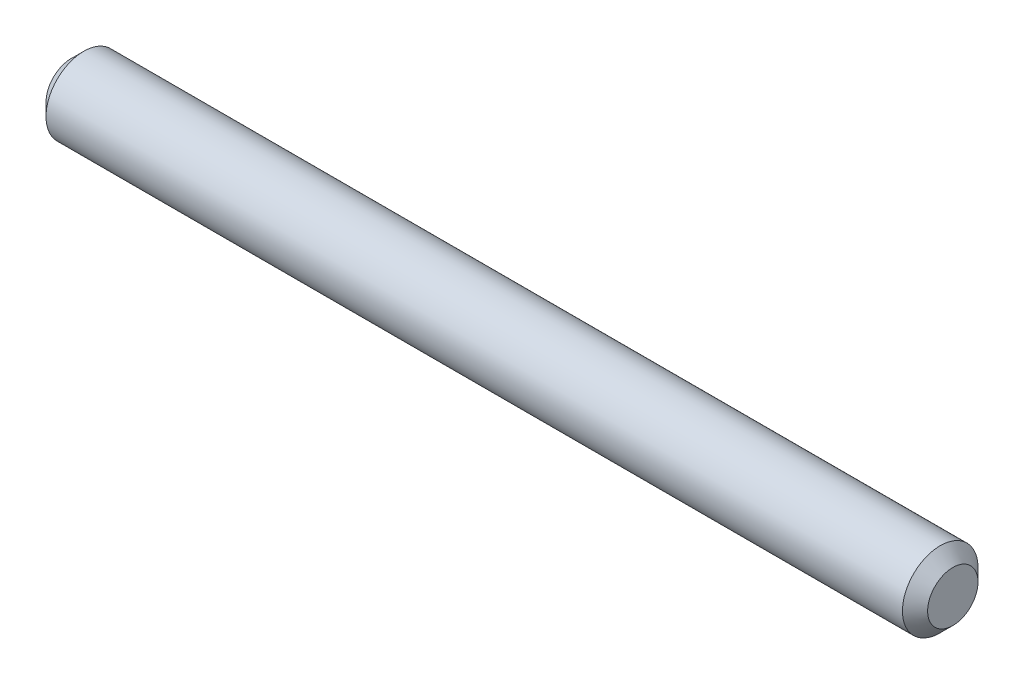
ISO-10303-21;
HEADER;
FILE_DESCRIPTION(('STEP AP214'),'2;1');
FILE_NAME('part.step','',(''),(''),'','','');
FILE_SCHEMA(('AUTOMOTIVE_DESIGN { 1 0 10303 214 1 1 1 1 }'));
ENDSEC;
DATA;
#1=APPLICATION_CONTEXT('core data for automotive mechanical design processes');
#2=APPLICATION_PROTOCOL_DEFINITION('international standard','automotive_design',2000,#1);
#3=PRODUCT_CONTEXT('',#1,'mechanical');
#4=PRODUCT('Part','Part','',(#3));
#5=PRODUCT_RELATED_PRODUCT_CATEGORY('part','',(#4));
#6=PRODUCT_DEFINITION_FORMATION('','',#4);
#7=PRODUCT_DEFINITION_CONTEXT('part definition',#1,'design');
#8=PRODUCT_DEFINITION('design','',#6,#7);
#9=PRODUCT_DEFINITION_SHAPE('','',#8);
#10=(LENGTH_UNIT() NAMED_UNIT(*) SI_UNIT(.MILLI.,.METRE.));
#11=(NAMED_UNIT(*) PLANE_ANGLE_UNIT() SI_UNIT($,.RADIAN.));
#12=(NAMED_UNIT(*) SI_UNIT($,.STERADIAN.) SOLID_ANGLE_UNIT());
#13=UNCERTAINTY_MEASURE_WITH_UNIT(LENGTH_MEASURE(1.E-05),#10,'distance_accuracy_value','');
#14=(GEOMETRIC_REPRESENTATION_CONTEXT(3) GLOBAL_UNCERTAINTY_ASSIGNED_CONTEXT((#13)) GLOBAL_UNIT_ASSIGNED_CONTEXT((#10,
#11,#12)) REPRESENTATION_CONTEXT('',''));
#15=CARTESIAN_POINT('',(0.,0.,0.));
#16=DIRECTION('',(0.,0.,1.));
#17=DIRECTION('',(1.,0.,0.));
#18=AXIS2_PLACEMENT_3D('',#15,#16,#17);
#19=CARTESIAN_POINT('',(70.,0.,0.));
#20=DIRECTION('',(-1.,0.,0.));
#21=DIRECTION('',(0.,0.,1.));
#22=AXIS2_PLACEMENT_3D('',#19,#20,#21);
#23=CYLINDRICAL_SURFACE('',#22,3.);
#24=CARTESIAN_POINT('',(1.00000000000003,0.,0.));
#25=DIRECTION('',(1.,0.,0.));
#26=DIRECTION('',(0.,0.,-1.));
#27=AXIS2_PLACEMENT_3D('',#24,#25,#26);
#28=CIRCLE('',#27,3.);
#29=CARTESIAN_POINT('',(1.00000000000003,0.,-3.));
#30=VERTEX_POINT('',#29);
#31=EDGE_CURVE('E50',#30,#30,#28,.T.);
#32=ORIENTED_EDGE('',*,*,#31,.T.);
#33=EDGE_LOOP('',(#32));
#34=FACE_BOUND('',#33,.T.);
#35=CARTESIAN_POINT('',(69.,0.,0.));
#36=DIRECTION('',(1.,0.,0.));
#37=DIRECTION('',(0.,0.,-1.));
#38=AXIS2_PLACEMENT_3D('',#35,#36,#37);
#39=CIRCLE('',#38,3.);
#40=CARTESIAN_POINT('',(69.,0.,-3.));
#41=VERTEX_POINT('',#40);
#42=EDGE_CURVE('E54',#41,#41,#39,.F.);
#43=ORIENTED_EDGE('',*,*,#42,.T.);
#44=EDGE_LOOP('',(#43));
#45=FACE_BOUND('',#44,.T.);
#46=ADVANCED_FACE('F38',(#34,#45),#23,.T.);
#47=CARTESIAN_POINT('',(70.,0.,0.));
#48=DIRECTION('',(1.,0.,0.));
#49=DIRECTION('',(0.,0.,-1.));
#50=AXIS2_PLACEMENT_3D('',#47,#48,#49);
#51=PLANE('',#50);
#52=CARTESIAN_POINT('',(70.,0.,0.));
#53=DIRECTION('',(1.,0.,0.));
#54=DIRECTION('',(0.,0.,-1.));
#55=AXIS2_PLACEMENT_3D('',#52,#53,#54);
#56=CIRCLE('',#55,2.);
#57=CARTESIAN_POINT('',(70.,0.,-2.));
#58=VERTEX_POINT('',#57);
#59=EDGE_CURVE('E10',#58,#58,#56,.T.);
#60=ORIENTED_EDGE('',*,*,#59,.T.);
#61=EDGE_LOOP('',(#60));
#62=FACE_BOUND('',#61,.T.);
#63=ADVANCED_FACE('F70',(#62),#51,.T.);
#64=CARTESIAN_POINT('',(0.,0.,0.));
#65=DIRECTION('',(1.,0.,0.));
#66=DIRECTION('',(0.,0.,-1.));
#67=AXIS2_PLACEMENT_3D('',#64,#65,#66);
#68=PLANE('',#67);
#69=CARTESIAN_POINT('',(0.,0.,0.));
#70=DIRECTION('',(1.,0.,0.));
#71=DIRECTION('',(0.,0.,-1.));
#72=AXIS2_PLACEMENT_3D('',#69,#70,#71);
#73=CIRCLE('',#72,1.99999999999997);
#74=CARTESIAN_POINT('',(0.,0.,-1.99999999999997));
#75=VERTEX_POINT('',#74);
#76=EDGE_CURVE('E46',#75,#75,#73,.F.);
#77=ORIENTED_EDGE('',*,*,#76,.T.);
#78=EDGE_LOOP('',(#77));
#79=FACE_BOUND('',#78,.T.);
#80=ADVANCED_FACE('F67',(#79),#68,.F.);
#81=CARTESIAN_POINT('',(1.00000000000003,0.,0.));
#82=DIRECTION('',(1.,0.,0.));
#83=DIRECTION('',(0.,0.,-1.));
#84=AXIS2_PLACEMENT_3D('',#81,#82,#83);
#85=CONICAL_SURFACE('',#84,3.,0.785398163397447);
#86=ORIENTED_EDGE('',*,*,#76,.F.);
#87=EDGE_LOOP('',(#86));
#88=FACE_BOUND('',#87,.T.);
#89=ORIENTED_EDGE('',*,*,#31,.F.);
#90=EDGE_LOOP('',(#89));
#91=FACE_BOUND('',#90,.T.);
#92=ADVANCED_FACE('F63',(#88,#91),#85,.T.);
#93=CARTESIAN_POINT('',(70.,0.,0.));
#94=DIRECTION('',(-1.,0.,0.));
#95=DIRECTION('',(0.,0.,1.));
#96=AXIS2_PLACEMENT_3D('',#93,#94,#95);
#97=CONICAL_SURFACE('',#96,2.,0.78539816339744);
#98=ORIENTED_EDGE('',*,*,#42,.F.);
#99=EDGE_LOOP('',(#98));
#100=FACE_BOUND('',#99,.T.);
#101=ORIENTED_EDGE('',*,*,#59,.F.);
#102=EDGE_LOOP('',(#101));
#103=FACE_BOUND('',#102,.T.);
#104=ADVANCED_FACE('F41',(#100,#103),#97,.T.);
#105=CLOSED_SHELL('',(#46,#63,#80,#92,#104));
#106=MANIFOLD_SOLID_BREP('B2',#105);
#107=ADVANCED_BREP_SHAPE_REPRESENTATION('',(#18,#106),#14);
#108=SHAPE_DEFINITION_REPRESENTATION(#9,#107);
ENDSEC;
END-ISO-10303-21;
